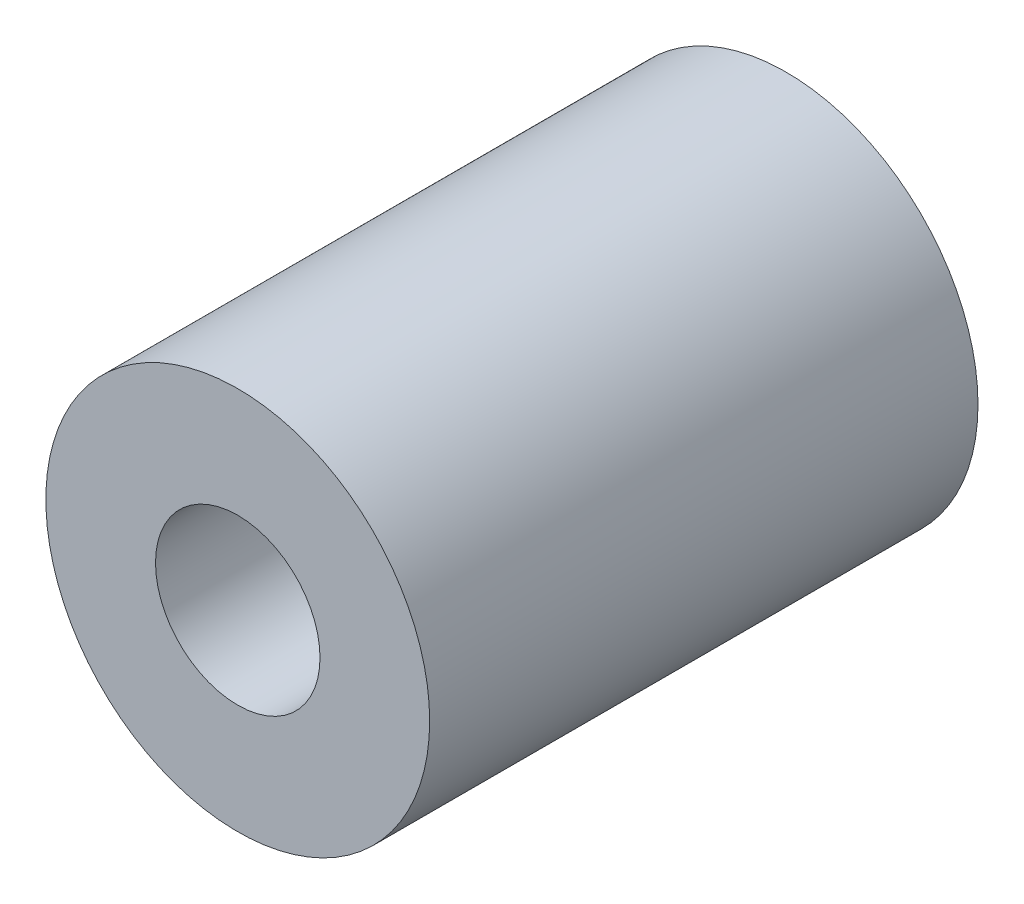
ISO-10303-21;
HEADER;
FILE_DESCRIPTION(('STEP AP214'),'2;1');
FILE_NAME('part.step','',(''),(''),'','','');
FILE_SCHEMA(('AUTOMOTIVE_DESIGN { 1 0 10303 214 1 1 1 1 }'));
ENDSEC;
DATA;
#1=APPLICATION_CONTEXT('core data for automotive mechanical design processes');
#2=APPLICATION_PROTOCOL_DEFINITION('international standard','automotive_design',2000,#1);
#3=PRODUCT_CONTEXT('',#1,'mechanical');
#4=PRODUCT('Part','Part','',(#3));
#5=PRODUCT_RELATED_PRODUCT_CATEGORY('part','',(#4));
#6=PRODUCT_DEFINITION_FORMATION('','',#4);
#7=PRODUCT_DEFINITION_CONTEXT('part definition',#1,'design');
#8=PRODUCT_DEFINITION('design','',#6,#7);
#9=PRODUCT_DEFINITION_SHAPE('','',#8);
#10=(LENGTH_UNIT() NAMED_UNIT(*) SI_UNIT(.MILLI.,.METRE.));
#11=(NAMED_UNIT(*) PLANE_ANGLE_UNIT() SI_UNIT($,.RADIAN.));
#12=(NAMED_UNIT(*) SI_UNIT($,.STERADIAN.) SOLID_ANGLE_UNIT());
#13=UNCERTAINTY_MEASURE_WITH_UNIT(LENGTH_MEASURE(1.E-05),#10,'distance_accuracy_value','');
#14=(GEOMETRIC_REPRESENTATION_CONTEXT(3) GLOBAL_UNCERTAINTY_ASSIGNED_CONTEXT((#13)) GLOBAL_UNIT_ASSIGNED_CONTEXT((#10,
#11,#12)) REPRESENTATION_CONTEXT('',''));
#15=CARTESIAN_POINT('',(0.,0.,0.));
#16=DIRECTION('',(0.,0.,1.));
#17=DIRECTION('',(1.,0.,0.));
#18=AXIS2_PLACEMENT_3D('',#15,#16,#17);
#19=CARTESIAN_POINT('',(0.,0.,5.));
#20=DIRECTION('',(0.,0.,1.));
#21=DIRECTION('',(1.,0.,0.));
#22=AXIS2_PLACEMENT_3D('',#19,#20,#21);
#23=PLANE('',#22);
#24=CARTESIAN_POINT('',(0.,0.,5.));
#25=DIRECTION('',(0.,0.,1.));
#26=DIRECTION('',(1.,0.,0.));
#27=AXIS2_PLACEMENT_3D('',#24,#25,#26);
#28=CIRCLE('',#27,3.5);
#29=CARTESIAN_POINT('',(3.5,0.,5.));
#30=VERTEX_POINT('',#29);
#31=EDGE_CURVE('E10',#30,#30,#28,.T.);
#32=ORIENTED_EDGE('',*,*,#31,.T.);
#33=EDGE_LOOP('',(#32));
#34=FACE_BOUND('',#33,.T.);
#35=CARTESIAN_POINT('',(0.,0.,5.));
#36=DIRECTION('',(0.,0.,1.));
#37=DIRECTION('',(1.,0.,0.));
#38=AXIS2_PLACEMENT_3D('',#35,#36,#37);
#39=CIRCLE('',#38,1.5);
#40=CARTESIAN_POINT('',(1.5,0.,5.));
#41=VERTEX_POINT('',#40);
#42=EDGE_CURVE('E42',#41,#41,#39,.T.);
#43=ORIENTED_EDGE('',*,*,#42,.F.);
#44=EDGE_LOOP('',(#43));
#45=FACE_BOUND('',#44,.T.);
#46=ADVANCED_FACE('F31',(#34,#45),#23,.T.);
#47=CARTESIAN_POINT('',(0.,0.,-5.));
#48=DIRECTION('',(0.,0.,1.));
#49=DIRECTION('',(1.,0.,0.));
#50=AXIS2_PLACEMENT_3D('',#47,#48,#49);
#51=PLANE('',#50);
#52=CARTESIAN_POINT('',(0.,0.,-5.));
#53=DIRECTION('',(0.,0.,1.));
#54=DIRECTION('',(1.,0.,0.));
#55=AXIS2_PLACEMENT_3D('',#52,#53,#54);
#56=CIRCLE('',#55,3.5);
#57=CARTESIAN_POINT('',(3.5,0.,-5.));
#58=VERTEX_POINT('',#57);
#59=EDGE_CURVE('E35',#58,#58,#56,.T.);
#60=ORIENTED_EDGE('',*,*,#59,.F.);
#61=EDGE_LOOP('',(#60));
#62=FACE_BOUND('',#61,.T.);
#63=CARTESIAN_POINT('',(0.,0.,-5.));
#64=DIRECTION('',(0.,0.,1.));
#65=DIRECTION('',(1.,0.,0.));
#66=AXIS2_PLACEMENT_3D('',#63,#64,#65);
#67=CIRCLE('',#66,1.5);
#68=CARTESIAN_POINT('',(1.5,0.,-5.));
#69=VERTEX_POINT('',#68);
#70=EDGE_CURVE('E44',#69,#69,#67,.T.);
#71=ORIENTED_EDGE('',*,*,#70,.T.);
#72=EDGE_LOOP('',(#71));
#73=FACE_BOUND('',#72,.T.);
#74=ADVANCED_FACE('F54',(#62,#73),#51,.F.);
#75=CARTESIAN_POINT('',(0.,0.,5.));
#76=DIRECTION('',(0.,0.,-1.));
#77=DIRECTION('',(-1.,0.,0.));
#78=AXIS2_PLACEMENT_3D('',#75,#76,#77);
#79=CYLINDRICAL_SURFACE('',#78,3.5);
#80=ORIENTED_EDGE('',*,*,#31,.F.);
#81=EDGE_LOOP('',(#80));
#82=FACE_BOUND('',#81,.T.);
#83=ORIENTED_EDGE('',*,*,#59,.T.);
#84=EDGE_LOOP('',(#83));
#85=FACE_BOUND('',#84,.T.);
#86=ADVANCED_FACE('F33',(#82,#85),#79,.T.);
#87=CARTESIAN_POINT('',(0.,0.,5.));
#88=DIRECTION('',(0.,0.,-1.));
#89=DIRECTION('',(-1.,0.,0.));
#90=AXIS2_PLACEMENT_3D('',#87,#88,#89);
#91=CYLINDRICAL_SURFACE('',#90,1.5);
#92=ORIENTED_EDGE('',*,*,#42,.T.);
#93=EDGE_LOOP('',(#92));
#94=FACE_BOUND('',#93,.T.);
#95=ORIENTED_EDGE('',*,*,#70,.F.);
#96=EDGE_LOOP('',(#95));
#97=FACE_BOUND('',#96,.T.);
#98=ADVANCED_FACE('F50',(#94,#97),#91,.F.);
#99=CLOSED_SHELL('',(#46,#74,#86,#98));
#100=MANIFOLD_SOLID_BREP('B2',#99);
#101=ADVANCED_BREP_SHAPE_REPRESENTATION('',(#18,#100),#14);
#102=SHAPE_DEFINITION_REPRESENTATION(#9,#101);
ENDSEC;
END-ISO-10303-21;
